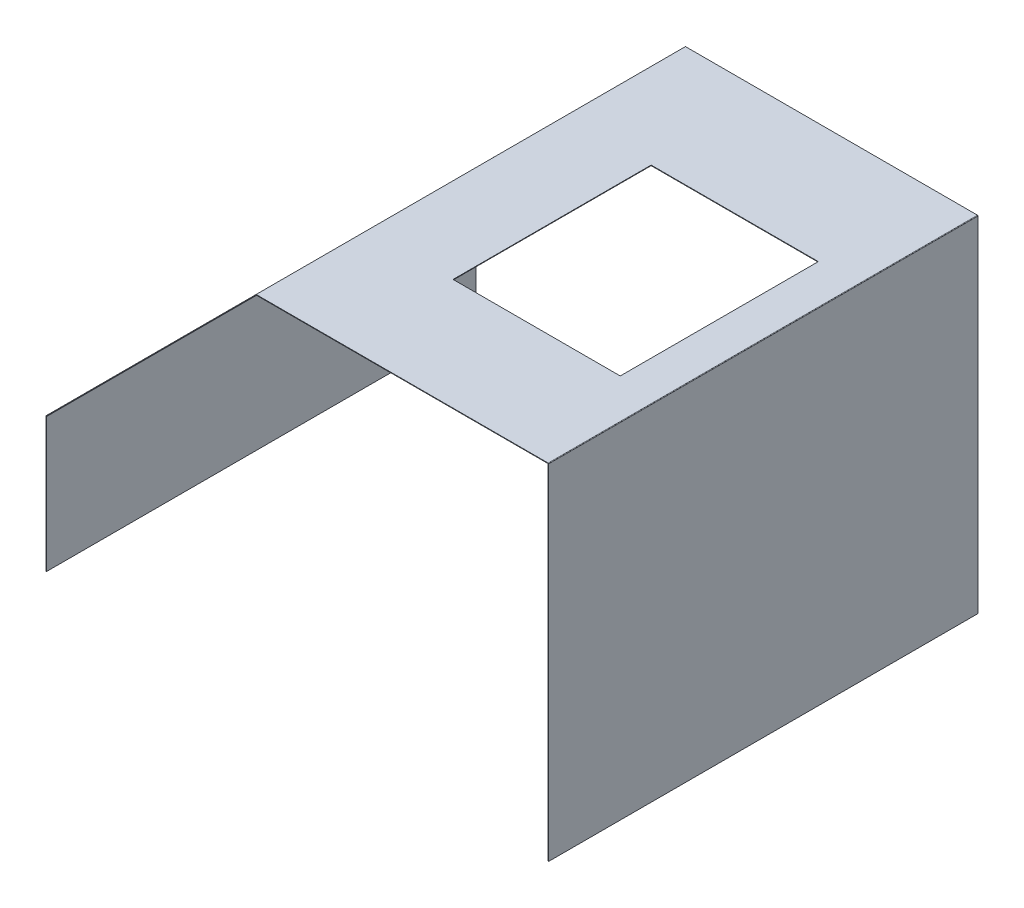
ISO-10303-21;
HEADER;
FILE_DESCRIPTION(('STEP AP214'),'2;1');
FILE_NAME('part.step','',(''),(''),'','','');
FILE_SCHEMA(('AUTOMOTIVE_DESIGN { 1 0 10303 214 1 1 1 1 }'));
ENDSEC;
DATA;
#1=APPLICATION_CONTEXT('core data for automotive mechanical design processes');
#2=APPLICATION_PROTOCOL_DEFINITION('international standard','automotive_design',2000,#1);
#3=PRODUCT_CONTEXT('',#1,'mechanical');
#4=PRODUCT('Part','Part','',(#3));
#5=PRODUCT_RELATED_PRODUCT_CATEGORY('part','',(#4));
#6=PRODUCT_DEFINITION_FORMATION('','',#4);
#7=PRODUCT_DEFINITION_CONTEXT('part definition',#1,'design');
#8=PRODUCT_DEFINITION('design','',#6,#7);
#9=PRODUCT_DEFINITION_SHAPE('','',#8);
#10=(LENGTH_UNIT() NAMED_UNIT(*) SI_UNIT(.MILLI.,.METRE.));
#11=(NAMED_UNIT(*) PLANE_ANGLE_UNIT() SI_UNIT($,.RADIAN.));
#12=(NAMED_UNIT(*) SI_UNIT($,.STERADIAN.) SOLID_ANGLE_UNIT());
#13=UNCERTAINTY_MEASURE_WITH_UNIT(LENGTH_MEASURE(1.E-05),#10,'distance_accuracy_value','');
#14=(GEOMETRIC_REPRESENTATION_CONTEXT(3) GLOBAL_UNCERTAINTY_ASSIGNED_CONTEXT((#13)) GLOBAL_UNIT_ASSIGNED_CONTEXT((#10,
#11,#12)) REPRESENTATION_CONTEXT('',''));
#15=CARTESIAN_POINT('',(0.,0.,0.));
#16=DIRECTION('',(0.,0.,1.));
#17=DIRECTION('',(1.,0.,0.));
#18=AXIS2_PLACEMENT_3D('',#15,#16,#17);
#19=CARTESIAN_POINT('',(705.,525.,655.66166));
#20=DIRECTION('',(1.,0.,0.));
#21=DIRECTION('',(0.,0.,-1.));
#22=AXIS2_PLACEMENT_3D('',#19,#20,#21);
#23=PLANE('',#22);
#24=DIRECTION('',(0.,1.,0.));
#25=VECTOR('',#24,1.);
#26=CARTESIAN_POINT('',(705.,525.,485.66166));
#27=LINE('',#26,#25);
#28=CARTESIAN_POINT('',(705.,525.,485.66166));
#29=VERTEX_POINT('',#28);
#30=CARTESIAN_POINT('',(705.,525.83566,485.66166));
#31=VERTEX_POINT('',#30);
#32=EDGE_CURVE('E474',#29,#31,#27,.T.);
#33=ORIENTED_EDGE('',*,*,#32,.T.);
#34=DIRECTION('',(0.,0.,-1.));
#35=VECTOR('',#34,1.);
#36=CARTESIAN_POINT('',(705.,525.83566,655.66166));
#37=LINE('',#36,#35);
#38=CARTESIAN_POINT('',(705.,525.83566,183.53566));
#39=VERTEX_POINT('',#38);
#40=EDGE_CURVE('E320',#31,#39,#37,.T.);
#41=ORIENTED_EDGE('',*,*,#40,.T.);
#42=DIRECTION('',(0.,1.,0.));
#43=VECTOR('',#42,1.);
#44=CARTESIAN_POINT('',(705.,525.,183.53566));
#45=LINE('',#44,#43);
#46=CARTESIAN_POINT('',(705.,525.,183.53566));
#47=VERTEX_POINT('',#46);
#48=EDGE_CURVE('E481',#47,#39,#45,.T.);
#49=ORIENTED_EDGE('',*,*,#48,.F.);
#50=DIRECTION('',(0.,0.,-1.));
#51=VECTOR('',#50,1.);
#52=CARTESIAN_POINT('',(705.,525.,655.66166));
#53=LINE('',#52,#51);
#54=EDGE_CURVE('E317',#29,#47,#53,.T.);
#55=ORIENTED_EDGE('',*,*,#54,.F.);
#56=EDGE_LOOP('',(#33,#41,#49,#55));
#57=FACE_BOUND('',#56,.T.);
#58=ADVANCED_FACE('F51',(#57),#23,.F.);
#59=CARTESIAN_POINT('',(450.,525.83566,655.66166));
#60=DIRECTION('',(-1.,0.,0.));
#61=DIRECTION('',(0.,0.,1.));
#62=AXIS2_PLACEMENT_3D('',#59,#60,#61);
#63=PLANE('',#62);
#64=DIRECTION('',(0.,-1.,0.));
#65=VECTOR('',#64,1.);
#66=CARTESIAN_POINT('',(450.,525.83566,485.66166));
#67=LINE('',#66,#65);
#68=CARTESIAN_POINT('',(450.,525.83566,485.66166));
#69=VERTEX_POINT('',#68);
#70=CARTESIAN_POINT('',(450.,525.,485.66166));
#71=VERTEX_POINT('',#70);
#72=EDGE_CURVE('E478',#69,#71,#67,.T.);
#73=ORIENTED_EDGE('',*,*,#72,.T.);
#74=DIRECTION('',(0.,0.,-1.));
#75=VECTOR('',#74,1.);
#76=CARTESIAN_POINT('',(450.,525.,655.66166));
#77=LINE('',#76,#75);
#78=CARTESIAN_POINT('',(450.,525.,183.53566));
#79=VERTEX_POINT('',#78);
#80=EDGE_CURVE('E369',#71,#79,#77,.T.);
#81=ORIENTED_EDGE('',*,*,#80,.T.);
#82=DIRECTION('',(0.,-1.,0.));
#83=VECTOR('',#82,1.);
#84=CARTESIAN_POINT('',(450.,525.83566,183.53566));
#85=LINE('',#84,#83);
#86=CARTESIAN_POINT('',(450.,525.83566,183.53566));
#87=VERTEX_POINT('',#86);
#88=EDGE_CURVE('E486',#87,#79,#85,.T.);
#89=ORIENTED_EDGE('',*,*,#88,.F.);
#90=DIRECTION('',(0.,0.,-1.));
#91=VECTOR('',#90,1.);
#92=CARTESIAN_POINT('',(450.,525.83566,655.66166));
#93=LINE('',#92,#91);
#94=EDGE_CURVE('E365',#69,#87,#93,.T.);
#95=ORIENTED_EDGE('',*,*,#94,.F.);
#96=EDGE_LOOP('',(#73,#81,#89,#95));
#97=FACE_BOUND('',#96,.T.);
#98=ADVANCED_FACE('F408',(#97),#63,.F.);
#99=CARTESIAN_POINT('',(320.,525.,13.53566));
#100=DIRECTION('',(-0.707106781186547,0.707106781186548,0.));
#101=DIRECTION('',(-0.707106781186548,-0.707106781186547,0.));
#102=AXIS2_PLACEMENT_3D('',#99,#100,#101);
#103=PLANE('',#102);
#104=DIRECTION('',(0.707106781186548,0.707106781186547,0.));
#105=VECTOR('',#104,1.);
#106=CARTESIAN_POINT('',(320.,525.,655.66166));
#107=LINE('',#106,#105);
#108=CARTESIAN_POINT('',(0.234314575050742,205.234314575051,655.66166));
#109=VERTEX_POINT('',#108);
#110=CARTESIAN_POINT('',(320.,525.,655.66166));
#111=VERTEX_POINT('',#110);
#112=EDGE_CURVE('E363',#109,#111,#107,.T.);
#113=ORIENTED_EDGE('',*,*,#112,.F.);
#114=DIRECTION('',(0.,0.,-1.));
#115=VECTOR('',#114,1.);
#116=CARTESIAN_POINT('',(0.234314575050769,205.234314575051,0.83566));
#117=LINE('',#116,#115);
#118=CARTESIAN_POINT('',(0.234314575050742,205.234314575051,0.83566));
#119=VERTEX_POINT('',#118);
#120=EDGE_CURVE('E264',#109,#119,#117,.T.);
#121=ORIENTED_EDGE('',*,*,#120,.T.);
#122=DIRECTION('',(0.707106781186548,0.707106781186547,0.));
#123=VECTOR('',#122,1.);
#124=CARTESIAN_POINT('',(320.,525.,0.83566));
#125=LINE('',#124,#123);
#126=CARTESIAN_POINT('',(320.,525.,0.83566));
#127=VERTEX_POINT('',#126);
#128=EDGE_CURVE('E308',#119,#127,#125,.T.);
#129=ORIENTED_EDGE('',*,*,#128,.T.);
#130=DIRECTION('',(0.,0.,-1.));
#131=VECTOR('',#130,1.);
#132=CARTESIAN_POINT('',(320.,525.,13.53566));
#133=LINE('',#132,#131);
#134=CARTESIAN_POINT('',(320.,525.,43.2486599999999));
#135=VERTEX_POINT('',#134);
#136=EDGE_CURVE('E260',#135,#127,#133,.T.);
#137=ORIENTED_EDGE('',*,*,#136,.F.);
#138=DIRECTION('',(-0.707106781186548,-0.707106781186547,0.));
#139=VECTOR('',#138,1.);
#140=CARTESIAN_POINT('',(320.,525.,43.2486599999999));
#141=LINE('',#140,#139);
#142=CARTESIAN_POINT('',(36.5247934744668,241.524793474467,43.24866));
#143=VERTEX_POINT('',#142);
#144=EDGE_CURVE('E463',#135,#143,#141,.T.);
#145=ORIENTED_EDGE('',*,*,#144,.T.);
#146=DIRECTION('',(0.,0.,1.));
#147=VECTOR('',#146,1.);
#148=CARTESIAN_POINT('',(36.5247934744667,241.524793474467,13.53566));
#149=LINE('',#148,#147);
#150=CARTESIAN_POINT('',(36.5247934744668,241.524793474467,613.24866));
#151=VERTEX_POINT('',#150);
#152=EDGE_CURVE('E452',#143,#151,#149,.T.);
#153=ORIENTED_EDGE('',*,*,#152,.T.);
#154=DIRECTION('',(0.707106781186548,0.707106781186547,0.));
#155=VECTOR('',#154,1.);
#156=CARTESIAN_POINT('',(320.,525.,613.24866));
#157=LINE('',#156,#155);
#158=CARTESIAN_POINT('',(320.,525.,613.24866));
#159=VERTEX_POINT('',#158);
#160=EDGE_CURVE('E469',#151,#159,#157,.T.);
#161=ORIENTED_EDGE('',*,*,#160,.T.);
#162=EDGE_CURVE('E261',#111,#159,#133,.T.);
#163=ORIENTED_EDGE('',*,*,#162,.F.);
#164=EDGE_LOOP('',(#113,#121,#129,#137,#145,#153,#161,#163));
#165=FACE_BOUND('',#164,.T.);
#166=ADVANCED_FACE('F361',(#165),#103,.F.);
#167=CARTESIAN_POINT('',(765.,525.,13.53566));
#168=DIRECTION('',(0.,1.,0.));
#169=DIRECTION('',(-1.,0.,0.));
#170=AXIS2_PLACEMENT_3D('',#167,#168,#169);
#171=PLANE('',#170);
#172=DIRECTION('',(1.,0.,0.));
#173=VECTOR('',#172,1.);
#174=CARTESIAN_POINT('',(765.,525.,0.83566));
#175=LINE('',#174,#173);
#176=CARTESIAN_POINT('',(764.2,525.,0.83566));
#177=VERTEX_POINT('',#176);
#178=EDGE_CURVE('E299',#127,#177,#175,.T.);
#179=ORIENTED_EDGE('',*,*,#178,.T.);
#180=DIRECTION('',(0.,0.,-1.));
#181=VECTOR('',#180,1.);
#182=CARTESIAN_POINT('',(764.2,525.,655.66166));
#183=LINE('',#182,#181);
#184=CARTESIAN_POINT('',(764.2,525.,655.66166));
#185=VERTEX_POINT('',#184);
#186=EDGE_CURVE('E72',#177,#185,#183,.F.);
#187=ORIENTED_EDGE('',*,*,#186,.T.);
#188=DIRECTION('',(1.,0.,0.));
#189=VECTOR('',#188,1.);
#190=CARTESIAN_POINT('',(765.,525.,655.66166));
#191=LINE('',#190,#189);
#192=EDGE_CURVE('E318',#111,#185,#191,.T.);
#193=ORIENTED_EDGE('',*,*,#192,.F.);
#194=ORIENTED_EDGE('',*,*,#162,.T.);
#195=DIRECTION('',(1.,0.,0.));
#196=VECTOR('',#195,1.);
#197=CARTESIAN_POINT('',(765.,525.,613.24866));
#198=LINE('',#197,#196);
#199=CARTESIAN_POINT('',(320.489518294468,525.,613.24866));
#200=VERTEX_POINT('',#199);
#201=EDGE_CURVE('E466',#159,#200,#198,.T.);
#202=ORIENTED_EDGE('',*,*,#201,.T.);
#203=DIRECTION('',(0.,0.,-1.));
#204=VECTOR('',#203,1.);
#205=CARTESIAN_POINT('',(320.489518294468,525.,13.53566));
#206=LINE('',#205,#204);
#207=CARTESIAN_POINT('',(320.489518294468,525.,43.2486599999999));
#208=VERTEX_POINT('',#207);
#209=EDGE_CURVE('E456',#200,#208,#206,.T.);
#210=ORIENTED_EDGE('',*,*,#209,.T.);
#211=DIRECTION('',(-1.,0.,0.));
#212=VECTOR('',#211,1.);
#213=CARTESIAN_POINT('',(765.,525.,43.2486599999998));
#214=LINE('',#213,#212);
#215=EDGE_CURVE('E214',#208,#135,#214,.T.);
#216=ORIENTED_EDGE('',*,*,#215,.T.);
#217=ORIENTED_EDGE('',*,*,#136,.T.);
#218=EDGE_LOOP('',(#179,#187,#193,#194,#202,#210,#216,#217));
#219=FACE_BOUND('',#218,.T.);
#220=DIRECTION('',(1.,0.,0.));
#221=VECTOR('',#220,1.);
#222=CARTESIAN_POINT('',(450.,525.,485.66166));
#223=LINE('',#222,#221);
#224=EDGE_CURVE('E471',#71,#29,#223,.T.);
#225=ORIENTED_EDGE('',*,*,#224,.T.);
#226=ORIENTED_EDGE('',*,*,#54,.T.);
#227=DIRECTION('',(1.,0.,0.));
#228=VECTOR('',#227,1.);
#229=CARTESIAN_POINT('',(450.,525.,183.53566));
#230=LINE('',#229,#228);
#231=EDGE_CURVE('E489',#79,#47,#230,.T.);
#232=ORIENTED_EDGE('',*,*,#231,.F.);
#233=ORIENTED_EDGE('',*,*,#80,.F.);
#234=EDGE_LOOP('',(#225,#226,#232,#233));
#235=FACE_BOUND('',#234,.T.);
#236=ADVANCED_FACE('F305',(#219,#235),#171,.F.);
#237=CARTESIAN_POINT('',(765.,0.,13.53566));
#238=DIRECTION('',(1.,0.,0.));
#239=DIRECTION('',(0.,0.,-1.));
#240=AXIS2_PLACEMENT_3D('',#237,#238,#239);
#241=PLANE('',#240);
#242=DIRECTION('',(0.,-1.,0.));
#243=VECTOR('',#242,1.);
#244=CARTESIAN_POINT('',(765.,525.,655.66166));
#245=LINE('',#244,#243);
#246=CARTESIAN_POINT('',(765.,524.2,655.66166));
#247=VERTEX_POINT('',#246);
#248=CARTESIAN_POINT('',(765.,0.,655.66166));
#249=VERTEX_POINT('',#248);
#250=EDGE_CURVE('E314',#247,#249,#245,.T.);
#251=ORIENTED_EDGE('',*,*,#250,.F.);
#252=DIRECTION('',(0.,0.,-1.));
#253=VECTOR('',#252,1.);
#254=CARTESIAN_POINT('',(765.,524.2,0.83566));
#255=LINE('',#254,#253);
#256=CARTESIAN_POINT('',(765.,524.2,0.83566));
#257=VERTEX_POINT('',#256);
#258=EDGE_CURVE('E282',#247,#257,#255,.T.);
#259=ORIENTED_EDGE('',*,*,#258,.T.);
#260=DIRECTION('',(0.,-1.,0.));
#261=VECTOR('',#260,1.);
#262=CARTESIAN_POINT('',(765.,0.,0.83566));
#263=LINE('',#262,#261);
#264=CARTESIAN_POINT('',(765.,0.,0.83566));
#265=VERTEX_POINT('',#264);
#266=EDGE_CURVE('E301',#257,#265,#263,.T.);
#267=ORIENTED_EDGE('',*,*,#266,.T.);
#268=DIRECTION('',(0.,0.,-1.));
#269=VECTOR('',#268,1.);
#270=CARTESIAN_POINT('',(765.,0.,13.53566));
#271=LINE('',#270,#269);
#272=EDGE_CURVE('E257',#249,#265,#271,.T.);
#273=ORIENTED_EDGE('',*,*,#272,.F.);
#274=EDGE_LOOP('',(#251,#259,#267,#273));
#275=FACE_BOUND('',#274,.T.);
#276=ADVANCED_FACE('F312',(#275),#241,.F.);
#277=CARTESIAN_POINT('',(765.,0.,13.53566));
#278=DIRECTION('',(0.,1.,0.));
#279=DIRECTION('',(0.,0.,1.));
#280=AXIS2_PLACEMENT_3D('',#277,#278,#279);
#281=PLANE('',#280);
#282=DIRECTION('',(1.,0.,0.));
#283=VECTOR('',#282,1.);
#284=CARTESIAN_POINT('',(765.,0.,0.83566));
#285=LINE('',#284,#283);
#286=CARTESIAN_POINT('',(765.83566,0.,0.83566));
#287=VERTEX_POINT('',#286);
#288=EDGE_CURVE('E329',#265,#287,#285,.T.);
#289=ORIENTED_EDGE('',*,*,#288,.T.);
#290=DIRECTION('',(0.,0.,-1.));
#291=VECTOR('',#290,1.);
#292=CARTESIAN_POINT('',(765.83566,0.,13.53566));
#293=LINE('',#292,#291);
#294=CARTESIAN_POINT('',(765.83566,0.,655.66166));
#295=VERTEX_POINT('',#294);
#296=EDGE_CURVE('E249',#295,#287,#293,.T.);
#297=ORIENTED_EDGE('',*,*,#296,.F.);
#298=DIRECTION('',(1.,0.,0.));
#299=VECTOR('',#298,1.);
#300=CARTESIAN_POINT('',(765.,0.,655.66166));
#301=LINE('',#300,#299);
#302=EDGE_CURVE('E379',#249,#295,#301,.T.);
#303=ORIENTED_EDGE('',*,*,#302,.F.);
#304=ORIENTED_EDGE('',*,*,#272,.T.);
#305=EDGE_LOOP('',(#289,#297,#303,#304));
#306=FACE_BOUND('',#305,.T.);
#307=ADVANCED_FACE('F509',(#306),#281,.F.);
#308=CARTESIAN_POINT('',(765.83566,0.,13.53566));
#309=DIRECTION('',(-1.,0.,0.));
#310=DIRECTION('',(0.,0.,1.));
#311=AXIS2_PLACEMENT_3D('',#308,#309,#310);
#312=PLANE('',#311);
#313=DIRECTION('',(0.,1.,0.));
#314=VECTOR('',#313,1.);
#315=CARTESIAN_POINT('',(765.83566,0.,0.83566));
#316=LINE('',#315,#314);
#317=CARTESIAN_POINT('',(765.83566,525.03566,0.83566));
#318=VERTEX_POINT('',#317);
#319=EDGE_CURVE('E331',#287,#318,#316,.T.);
#320=ORIENTED_EDGE('',*,*,#319,.T.);
#321=DIRECTION('',(0.,0.,-1.));
#322=VECTOR('',#321,1.);
#323=CARTESIAN_POINT('',(765.83566,525.03566,13.53566));
#324=LINE('',#323,#322);
#325=CARTESIAN_POINT('',(765.83566,525.03566,655.66166));
#326=VERTEX_POINT('',#325);
#327=EDGE_CURVE('E288',#318,#326,#324,.F.);
#328=ORIENTED_EDGE('',*,*,#327,.T.);
#329=DIRECTION('',(0.,1.,0.));
#330=VECTOR('',#329,1.);
#331=CARTESIAN_POINT('',(765.83566,0.,655.66166));
#332=LINE('',#331,#330);
#333=EDGE_CURVE('E381',#295,#326,#332,.T.);
#334=ORIENTED_EDGE('',*,*,#333,.F.);
#335=ORIENTED_EDGE('',*,*,#296,.T.);
#336=EDGE_LOOP('',(#320,#328,#334,#335));
#337=FACE_BOUND('',#336,.T.);
#338=ADVANCED_FACE('F502',(#337),#312,.F.);
#339=CARTESIAN_POINT('',(765.83566,525.83566,13.53566));
#340=DIRECTION('',(0.,-1.,0.));
#341=DIRECTION('',(0.,0.,-1.));
#342=AXIS2_PLACEMENT_3D('',#339,#340,#341);
#343=PLANE('',#342);
#344=ORIENTED_EDGE('',*,*,#40,.F.);
#345=DIRECTION('',(-1.,0.,0.));
#346=VECTOR('',#345,1.);
#347=CARTESIAN_POINT('',(705.,525.83566,485.66166));
#348=LINE('',#347,#346);
#349=EDGE_CURVE('E476',#31,#69,#348,.T.);
#350=ORIENTED_EDGE('',*,*,#349,.T.);
#351=ORIENTED_EDGE('',*,*,#94,.T.);
#352=DIRECTION('',(-1.,0.,0.));
#353=VECTOR('',#352,1.);
#354=CARTESIAN_POINT('',(705.,525.83566,183.53566));
#355=LINE('',#354,#353);
#356=EDGE_CURVE('E483',#39,#87,#355,.T.);
#357=ORIENTED_EDGE('',*,*,#356,.F.);
#358=EDGE_LOOP('',(#344,#350,#351,#357));
#359=FACE_BOUND('',#358,.T.);
#360=DIRECTION('',(-1.,0.,0.));
#361=VECTOR('',#360,1.);
#362=CARTESIAN_POINT('',(705.,525.83566,655.66166));
#363=LINE('',#362,#361);
#364=CARTESIAN_POINT('',(765.03566,525.83566,655.66166));
#365=VERTEX_POINT('',#364);
#366=CARTESIAN_POINT('',(319.653858294467,525.83566,655.66166));
#367=VERTEX_POINT('',#366);
#368=EDGE_CURVE('E322',#365,#367,#363,.T.);
#369=ORIENTED_EDGE('',*,*,#368,.F.);
#370=DIRECTION('',(0.,0.,-1.));
#371=VECTOR('',#370,1.);
#372=CARTESIAN_POINT('',(765.03566,525.83566,13.53566));
#373=LINE('',#372,#371);
#374=CARTESIAN_POINT('',(765.03566,525.83566,0.83566));
#375=VERTEX_POINT('',#374);
#376=EDGE_CURVE('E286',#365,#375,#373,.T.);
#377=ORIENTED_EDGE('',*,*,#376,.T.);
#378=DIRECTION('',(-1.,0.,0.));
#379=VECTOR('',#378,1.);
#380=CARTESIAN_POINT('',(765.83566,525.83566,0.83566));
#381=LINE('',#380,#379);
#382=CARTESIAN_POINT('',(319.653858294467,525.83566,0.83566));
#383=VERTEX_POINT('',#382);
#384=EDGE_CURVE('E245',#375,#383,#381,.T.);
#385=ORIENTED_EDGE('',*,*,#384,.T.);
#386=DIRECTION('',(0.,0.,-1.));
#387=VECTOR('',#386,1.);
#388=CARTESIAN_POINT('',(319.653858294467,525.83566,13.53566));
#389=LINE('',#388,#387);
#390=CARTESIAN_POINT('',(319.653858294467,525.83566,43.2486599999999));
#391=VERTEX_POINT('',#390);
#392=EDGE_CURVE('E235',#391,#383,#389,.T.);
#393=ORIENTED_EDGE('',*,*,#392,.F.);
#394=DIRECTION('',(0.,0.,-1.));
#395=VECTOR('',#394,1.);
#396=CARTESIAN_POINT('',(319.653858294467,525.83566,43.2486599999999));
#397=LINE('',#396,#395);
#398=CARTESIAN_POINT('',(319.653858294467,525.83566,613.24866));
#399=VERTEX_POINT('',#398);
#400=EDGE_CURVE('E222',#399,#391,#397,.T.);
#401=ORIENTED_EDGE('',*,*,#400,.F.);
#402=EDGE_CURVE('E246',#367,#399,#389,.T.);
#403=ORIENTED_EDGE('',*,*,#402,.F.);
#404=EDGE_LOOP('',(#369,#377,#385,#393,#401,#403));
#405=FACE_BOUND('',#404,.T.);
#406=ADVANCED_FACE('F242',(#359,#405),#343,.F.);
#407=CARTESIAN_POINT('',(319.653858294467,525.83566,13.53566));
#408=DIRECTION('',(0.707106781186548,-0.707106781186548,0.));
#409=DIRECTION('',(0.707106781186548,0.707106781186548,0.));
#410=AXIS2_PLACEMENT_3D('',#407,#408,#409);
#411=PLANE('',#410);
#412=DIRECTION('',(-0.707106781186547,-0.707106781186547,0.));
#413=VECTOR('',#412,1.);
#414=CARTESIAN_POINT('',(319.653858294467,525.83566,0.83566));
#415=LINE('',#414,#413);
#416=CARTESIAN_POINT('',(-0.601345424949162,205.580456280583,0.83566));
#417=VERTEX_POINT('',#416);
#418=EDGE_CURVE('E335',#383,#417,#415,.T.);
#419=ORIENTED_EDGE('',*,*,#418,.T.);
#420=DIRECTION('',(0.,0.,-1.));
#421=VECTOR('',#420,1.);
#422=CARTESIAN_POINT('',(-0.601345424949218,205.580456280583,13.53566));
#423=LINE('',#422,#421);
#424=CARTESIAN_POINT('',(-0.601345424949229,205.580456280583,655.66166));
#425=VERTEX_POINT('',#424);
#426=EDGE_CURVE('E276',#417,#425,#423,.F.);
#427=ORIENTED_EDGE('',*,*,#426,.T.);
#428=DIRECTION('',(-0.707106781186547,-0.707106781186547,0.));
#429=VECTOR('',#428,1.);
#430=CARTESIAN_POINT('',(-0.83566,205.346141705533,655.66166));
#431=LINE('',#430,#429);
#432=EDGE_CURVE('E376',#367,#425,#431,.T.);
#433=ORIENTED_EDGE('',*,*,#432,.F.);
#434=ORIENTED_EDGE('',*,*,#402,.T.);
#435=DIRECTION('',(0.707106781186547,0.707106781186548,0.));
#436=VECTOR('',#435,1.);
#437=CARTESIAN_POINT('',(35.9338926217004,242.115694327233,613.24866));
#438=LINE('',#437,#436);
#439=CARTESIAN_POINT('',(35.9338926217004,242.115694327233,613.24866));
#440=VERTEX_POINT('',#439);
#441=EDGE_CURVE('E229',#440,#399,#438,.T.);
#442=ORIENTED_EDGE('',*,*,#441,.F.);
#443=DIRECTION('',(0.,0.,1.));
#444=VECTOR('',#443,1.);
#445=CARTESIAN_POINT('',(35.9338926217004,242.115694327233,43.24866));
#446=LINE('',#445,#444);
#447=CARTESIAN_POINT('',(35.9338926217004,242.115694327233,43.24866));
#448=VERTEX_POINT('',#447);
#449=EDGE_CURVE('E239',#448,#440,#446,.T.);
#450=ORIENTED_EDGE('',*,*,#449,.F.);
#451=DIRECTION('',(-0.707106781186547,-0.707106781186548,0.));
#452=VECTOR('',#451,1.);
#453=CARTESIAN_POINT('',(35.9338926217004,242.115694327233,43.24866));
#454=LINE('',#453,#452);
#455=EDGE_CURVE('E211',#391,#448,#454,.T.);
#456=ORIENTED_EDGE('',*,*,#455,.F.);
#457=ORIENTED_EDGE('',*,*,#392,.T.);
#458=EDGE_LOOP('',(#419,#427,#433,#434,#442,#450,#456,#457));
#459=FACE_BOUND('',#458,.T.);
#460=ADVANCED_FACE('F234',(#459),#411,.F.);
#461=CARTESIAN_POINT('',(-0.83566,205.346141705533,13.53566));
#462=DIRECTION('',(1.,0.,0.));
#463=DIRECTION('',(0.,0.,-1.));
#464=AXIS2_PLACEMENT_3D('',#461,#462,#463);
#465=PLANE('',#464);
#466=DIRECTION('',(0.,-1.,0.));
#467=VECTOR('',#466,1.);
#468=CARTESIAN_POINT('',(-0.83566,0.,655.66166));
#469=LINE('',#468,#467);
#470=CARTESIAN_POINT('',(-0.83566,205.014770855634,655.66166));
#471=VERTEX_POINT('',#470);
#472=CARTESIAN_POINT('',(-0.83566,0.,655.66166));
#473=VERTEX_POINT('',#472);
#474=EDGE_CURVE('E374',#471,#473,#469,.T.);
#475=ORIENTED_EDGE('',*,*,#474,.F.);
#476=DIRECTION('',(0.,0.,-1.));
#477=VECTOR('',#476,1.);
#478=CARTESIAN_POINT('',(-0.83566,205.014770855634,13.53566));
#479=LINE('',#478,#477);
#480=CARTESIAN_POINT('',(-0.83566,205.014770855634,0.83566));
#481=VERTEX_POINT('',#480);
#482=EDGE_CURVE('E269',#471,#481,#479,.T.);
#483=ORIENTED_EDGE('',*,*,#482,.T.);
#484=DIRECTION('',(0.,-1.,0.));
#485=VECTOR('',#484,1.);
#486=CARTESIAN_POINT('',(-0.83566,205.346141705533,0.83566));
#487=LINE('',#486,#485);
#488=CARTESIAN_POINT('',(-0.83566,0.,0.83566));
#489=VERTEX_POINT('',#488);
#490=EDGE_CURVE('E337',#481,#489,#487,.T.);
#491=ORIENTED_EDGE('',*,*,#490,.T.);
#492=DIRECTION('',(0.,0.,-1.));
#493=VECTOR('',#492,1.);
#494=CARTESIAN_POINT('',(-0.83566,0.,13.53566));
#495=LINE('',#494,#493);
#496=EDGE_CURVE('E247',#473,#489,#495,.T.);
#497=ORIENTED_EDGE('',*,*,#496,.F.);
#498=EDGE_LOOP('',(#475,#483,#491,#497));
#499=FACE_BOUND('',#498,.T.);
#500=ADVANCED_FACE('F395',(#499),#465,.F.);
#501=CARTESIAN_POINT('',(0.,0.,13.53566));
#502=DIRECTION('',(0.,1.,0.));
#503=DIRECTION('',(0.,0.,1.));
#504=AXIS2_PLACEMENT_3D('',#501,#502,#503);
#505=PLANE('',#504);
#506=DIRECTION('',(1.,0.,0.));
#507=VECTOR('',#506,1.);
#508=CARTESIAN_POINT('',(0.,0.,0.83566));
#509=LINE('',#508,#507);
#510=CARTESIAN_POINT('',(0.,0.,0.83566));
#511=VERTEX_POINT('',#510);
#512=EDGE_CURVE('E339',#489,#511,#509,.T.);
#513=ORIENTED_EDGE('',*,*,#512,.T.);
#514=DIRECTION('',(0.,0.,-1.));
#515=VECTOR('',#514,1.);
#516=CARTESIAN_POINT('',(0.,0.,13.53566));
#517=LINE('',#516,#515);
#518=CARTESIAN_POINT('',(0.,0.,655.66166));
#519=VERTEX_POINT('',#518);
#520=EDGE_CURVE('E251',#519,#511,#517,.T.);
#521=ORIENTED_EDGE('',*,*,#520,.F.);
#522=DIRECTION('',(1.,0.,0.));
#523=VECTOR('',#522,1.);
#524=CARTESIAN_POINT('',(0.,0.,655.66166));
#525=LINE('',#524,#523);
#526=EDGE_CURVE('E367',#473,#519,#525,.T.);
#527=ORIENTED_EDGE('',*,*,#526,.F.);
#528=ORIENTED_EDGE('',*,*,#496,.T.);
#529=EDGE_LOOP('',(#513,#521,#527,#528));
#530=FACE_BOUND('',#529,.T.);
#531=ADVANCED_FACE('F396',(#530),#505,.F.);
#532=CARTESIAN_POINT('',(0.,205.,13.53566));
#533=DIRECTION('',(-1.,0.,0.));
#534=DIRECTION('',(0.,-1.,0.));
#535=AXIS2_PLACEMENT_3D('',#532,#533,#534);
#536=PLANE('',#535);
#537=DIRECTION('',(0.,1.,0.));
#538=VECTOR('',#537,1.);
#539=CARTESIAN_POINT('',(0.,205.,0.83566));
#540=LINE('',#539,#538);
#541=CARTESIAN_POINT('',(0.,204.668629150101,0.83566));
#542=VERTEX_POINT('',#541);
#543=EDGE_CURVE('E341',#511,#542,#540,.T.);
#544=ORIENTED_EDGE('',*,*,#543,.T.);
#545=DIRECTION('',(0.,0.,-1.));
#546=VECTOR('',#545,1.);
#547=CARTESIAN_POINT('',(0.,204.668629150101,655.66166));
#548=LINE('',#547,#546);
#549=CARTESIAN_POINT('',(0.,204.668629150101,655.66166));
#550=VERTEX_POINT('',#549);
#551=EDGE_CURVE('E267',#542,#550,#548,.F.);
#552=ORIENTED_EDGE('',*,*,#551,.T.);
#553=DIRECTION('',(0.,1.,0.));
#554=VECTOR('',#553,1.);
#555=CARTESIAN_POINT('',(0.,205.,655.66166));
#556=LINE('',#555,#554);
#557=EDGE_CURVE('E350',#519,#550,#556,.T.);
#558=ORIENTED_EDGE('',*,*,#557,.F.);
#559=ORIENTED_EDGE('',*,*,#520,.T.);
#560=EDGE_LOOP('',(#544,#552,#558,#559));
#561=FACE_BOUND('',#560,.T.);
#562=ADVANCED_FACE('F347',(#561),#536,.F.);
#563=CARTESIAN_POINT('',(0.,0.,0.83566));
#564=DIRECTION('',(0.,0.,1.));
#565=DIRECTION('',(1.,0.,0.));
#566=AXIS2_PLACEMENT_3D('',#563,#564,#565);
#567=PLANE('',#566);
#568=ORIENTED_EDGE('',*,*,#490,.F.);
#569=CARTESIAN_POINT('',(-0.0356600000000001,205.014770855634,0.83566));
#570=DIRECTION('',(0.,0.,1.));
#571=DIRECTION('',(1.,0.,0.));
#572=AXIS2_PLACEMENT_3D('',#569,#570,#571);
#573=CIRCLE('',#572,0.8);
#574=EDGE_CURVE('E274',#481,#417,#573,.F.);
#575=ORIENTED_EDGE('',*,*,#574,.T.);
#576=ORIENTED_EDGE('',*,*,#418,.F.);
#577=ORIENTED_EDGE('',*,*,#384,.F.);
#578=CARTESIAN_POINT('',(765.03566,525.03566,0.83566));
#579=DIRECTION('',(0.,0.,1.));
#580=DIRECTION('',(1.,0.,0.));
#581=AXIS2_PLACEMENT_3D('',#578,#579,#580);
#582=CIRCLE('',#581,0.8);
#583=EDGE_CURVE('E272',#375,#318,#582,.F.);
#584=ORIENTED_EDGE('',*,*,#583,.T.);
#585=ORIENTED_EDGE('',*,*,#319,.F.);
#586=ORIENTED_EDGE('',*,*,#288,.F.);
#587=ORIENTED_EDGE('',*,*,#266,.F.);
#588=CARTESIAN_POINT('',(764.2,524.2,0.83566));
#589=DIRECTION('',(0.,0.,1.));
#590=DIRECTION('',(1.,0.,0.));
#591=AXIS2_PLACEMENT_3D('',#588,#589,#590);
#592=CIRCLE('',#591,0.8);
#593=EDGE_CURVE('E59',#257,#177,#592,.T.);
#594=ORIENTED_EDGE('',*,*,#593,.T.);
#595=ORIENTED_EDGE('',*,*,#178,.F.);
#596=ORIENTED_EDGE('',*,*,#128,.F.);
#597=CARTESIAN_POINT('',(0.800000000000023,204.668629150101,0.83566));
#598=DIRECTION('',(0.,0.,1.));
#599=DIRECTION('',(1.,0.,0.));
#600=AXIS2_PLACEMENT_3D('',#597,#598,#599);
#601=CIRCLE('',#600,0.8);
#602=EDGE_CURVE('E290',#119,#542,#601,.T.);
#603=ORIENTED_EDGE('',*,*,#602,.T.);
#604=ORIENTED_EDGE('',*,*,#543,.F.);
#605=ORIENTED_EDGE('',*,*,#512,.F.);
#606=EDGE_LOOP('',(#568,#575,#576,#577,#584,#585,#586,#587,#594,#595,#596,#603,#604,#605));
#607=FACE_BOUND('',#606,.T.);
#608=ADVANCED_FACE('F297',(#607),#567,.F.);
#609=CARTESIAN_POINT('',(0.,0.,655.66166));
#610=DIRECTION('',(0.,0.,1.));
#611=DIRECTION('',(1.,0.,0.));
#612=AXIS2_PLACEMENT_3D('',#609,#610,#611);
#613=PLANE('',#612);
#614=ORIENTED_EDGE('',*,*,#432,.T.);
#615=CARTESIAN_POINT('',(-0.0356600000000001,205.014770855634,655.66166));
#616=DIRECTION('',(0.,0.,1.));
#617=DIRECTION('',(1.,0.,0.));
#618=AXIS2_PLACEMENT_3D('',#615,#616,#617);
#619=CIRCLE('',#618,0.8);
#620=EDGE_CURVE('E280',#425,#471,#619,.T.);
#621=ORIENTED_EDGE('',*,*,#620,.T.);
#622=ORIENTED_EDGE('',*,*,#474,.T.);
#623=ORIENTED_EDGE('',*,*,#526,.T.);
#624=ORIENTED_EDGE('',*,*,#557,.T.);
#625=CARTESIAN_POINT('',(0.800000000000023,204.668629150101,655.66166));
#626=DIRECTION('',(0.,0.,1.));
#627=DIRECTION('',(1.,0.,0.));
#628=AXIS2_PLACEMENT_3D('',#625,#626,#627);
#629=CIRCLE('',#628,0.8);
#630=EDGE_CURVE('E292',#550,#109,#629,.F.);
#631=ORIENTED_EDGE('',*,*,#630,.T.);
#632=ORIENTED_EDGE('',*,*,#112,.T.);
#633=ORIENTED_EDGE('',*,*,#192,.T.);
#634=CARTESIAN_POINT('',(764.2,524.2,655.66166));
#635=DIRECTION('',(0.,0.,1.));
#636=DIRECTION('',(1.,0.,0.));
#637=AXIS2_PLACEMENT_3D('',#634,#635,#636);
#638=CIRCLE('',#637,0.8);
#639=EDGE_CURVE('E11',#185,#247,#638,.F.);
#640=ORIENTED_EDGE('',*,*,#639,.T.);
#641=ORIENTED_EDGE('',*,*,#250,.T.);
#642=ORIENTED_EDGE('',*,*,#302,.T.);
#643=ORIENTED_EDGE('',*,*,#333,.T.);
#644=CARTESIAN_POINT('',(765.03566,525.03566,655.66166));
#645=DIRECTION('',(0.,0.,1.));
#646=DIRECTION('',(1.,0.,0.));
#647=AXIS2_PLACEMENT_3D('',#644,#645,#646);
#648=CIRCLE('',#647,0.8);
#649=EDGE_CURVE('E278',#326,#365,#648,.T.);
#650=ORIENTED_EDGE('',*,*,#649,.T.);
#651=ORIENTED_EDGE('',*,*,#368,.T.);
#652=EDGE_LOOP('',(#614,#621,#622,#623,#624,#631,#632,#633,#640,#641,#642,#643,#650,#651));
#653=FACE_BOUND('',#652,.T.);
#654=ADVANCED_FACE('F383',(#653),#613,.T.);
#655=CARTESIAN_POINT('',(0.,0.,183.53566));
#656=DIRECTION('',(0.,0.,1.));
#657=DIRECTION('',(1.,0.,0.));
#658=AXIS2_PLACEMENT_3D('',#655,#656,#657);
#659=PLANE('',#658);
#660=ORIENTED_EDGE('',*,*,#48,.T.);
#661=ORIENTED_EDGE('',*,*,#356,.T.);
#662=ORIENTED_EDGE('',*,*,#88,.T.);
#663=ORIENTED_EDGE('',*,*,#231,.T.);
#664=EDGE_LOOP('',(#660,#661,#662,#663));
#665=FACE_BOUND('',#664,.T.);
#666=ADVANCED_FACE('F423',(#665),#659,.T.);
#667=CARTESIAN_POINT('',(0.,0.,485.66166));
#668=DIRECTION('',(0.,0.,1.));
#669=DIRECTION('',(1.,0.,0.));
#670=AXIS2_PLACEMENT_3D('',#667,#668,#669);
#671=PLANE('',#670);
#672=ORIENTED_EDGE('',*,*,#224,.F.);
#673=ORIENTED_EDGE('',*,*,#72,.F.);
#674=ORIENTED_EDGE('',*,*,#349,.F.);
#675=ORIENTED_EDGE('',*,*,#32,.F.);
#676=EDGE_LOOP('',(#672,#673,#674,#675));
#677=FACE_BOUND('',#676,.T.);
#678=ADVANCED_FACE('F427',(#677),#671,.F.);
#679=CARTESIAN_POINT('',(170.284181047144,107.765405901789,613.24866));
#680=DIRECTION('',(0.,0.,1.));
#681=DIRECTION('',(0.,-1.,0.));
#682=AXIS2_PLACEMENT_3D('',#679,#680,#681);
#683=PLANE('',#682);
#684=DIRECTION('',(-0.707106781186548,0.707106781186547,0.));
#685=VECTOR('',#684,1.);
#686=CARTESIAN_POINT('',(170.284181047144,107.765405901789,613.24866));
#687=LINE('',#686,#685);
#688=EDGE_CURVE('E454',#151,#440,#687,.T.);
#689=ORIENTED_EDGE('',*,*,#688,.T.);
#690=ORIENTED_EDGE('',*,*,#441,.T.);
#691=DIRECTION('',(-0.707106781186548,0.707106781186547,0.));
#692=VECTOR('',#691,1.);
#693=CARTESIAN_POINT('',(454.004146719911,391.485371574556,613.24866));
#694=LINE('',#693,#692);
#695=EDGE_CURVE('E218',#200,#399,#694,.T.);
#696=ORIENTED_EDGE('',*,*,#695,.F.);
#697=ORIENTED_EDGE('',*,*,#201,.F.);
#698=ORIENTED_EDGE('',*,*,#160,.F.);
#699=EDGE_LOOP('',(#689,#690,#696,#697,#698));
#700=FACE_BOUND('',#699,.T.);
#701=ADVANCED_FACE('F433',(#700),#683,.F.);
#702=CARTESIAN_POINT('',(170.284181047144,107.765405901789,43.24866));
#703=DIRECTION('',(-0.707106781186547,-0.707106781186548,0.));
#704=DIRECTION('',(0.707106781186548,-0.707106781186547,0.));
#705=AXIS2_PLACEMENT_3D('',#702,#703,#704);
#706=PLANE('',#705);
#707=DIRECTION('',(-0.707106781186548,0.707106781186547,0.));
#708=VECTOR('',#707,1.);
#709=CARTESIAN_POINT('',(170.284181047144,107.765405901789,43.24866));
#710=LINE('',#709,#708);
#711=EDGE_CURVE('E217',#143,#448,#710,.T.);
#712=ORIENTED_EDGE('',*,*,#711,.T.);
#713=ORIENTED_EDGE('',*,*,#449,.T.);
#714=ORIENTED_EDGE('',*,*,#688,.F.);
#715=ORIENTED_EDGE('',*,*,#152,.F.);
#716=EDGE_LOOP('',(#712,#713,#714,#715));
#717=FACE_BOUND('',#716,.T.);
#718=ADVANCED_FACE('F440',(#717),#706,.F.);
#719=CARTESIAN_POINT('',(170.284181047144,107.765405901789,43.24866));
#720=DIRECTION('',(0.,0.,-1.));
#721=DIRECTION('',(0.,1.,0.));
#722=AXIS2_PLACEMENT_3D('',#719,#720,#721);
#723=PLANE('',#722);
#724=ORIENTED_EDGE('',*,*,#215,.F.);
#725=DIRECTION('',(-0.707106781186548,0.707106781186547,0.));
#726=VECTOR('',#725,1.);
#727=CARTESIAN_POINT('',(454.004146719911,391.485371574556,43.2486599999999));
#728=LINE('',#727,#726);
#729=EDGE_CURVE('E206',#208,#391,#728,.T.);
#730=ORIENTED_EDGE('',*,*,#729,.T.);
#731=ORIENTED_EDGE('',*,*,#455,.T.);
#732=ORIENTED_EDGE('',*,*,#711,.F.);
#733=ORIENTED_EDGE('',*,*,#144,.F.);
#734=EDGE_LOOP('',(#724,#730,#731,#732,#733));
#735=FACE_BOUND('',#734,.T.);
#736=ADVANCED_FACE('F208',(#735),#723,.F.);
#737=CARTESIAN_POINT('',(454.004146719911,391.485371574556,43.2486599999999));
#738=DIRECTION('',(0.707106781186547,0.707106781186548,0.));
#739=DIRECTION('',(-0.707106781186548,0.707106781186547,0.));
#740=AXIS2_PLACEMENT_3D('',#737,#738,#739);
#741=PLANE('',#740);
#742=ORIENTED_EDGE('',*,*,#695,.T.);
#743=ORIENTED_EDGE('',*,*,#400,.T.);
#744=ORIENTED_EDGE('',*,*,#729,.F.);
#745=ORIENTED_EDGE('',*,*,#209,.F.);
#746=EDGE_LOOP('',(#742,#743,#744,#745));
#747=FACE_BOUND('',#746,.T.);
#748=ADVANCED_FACE('F223',(#747),#741,.F.);
#749=CARTESIAN_POINT('',(0.800000000000023,204.668629150101,13.53566));
#750=DIRECTION('',(0.,0.,1.));
#751=DIRECTION('',(1.,0.,0.));
#752=AXIS2_PLACEMENT_3D('',#749,#750,#751);
#753=CYLINDRICAL_SURFACE('',#752,0.8);
#754=ORIENTED_EDGE('',*,*,#630,.F.);
#755=ORIENTED_EDGE('',*,*,#551,.F.);
#756=ORIENTED_EDGE('',*,*,#602,.F.);
#757=ORIENTED_EDGE('',*,*,#120,.F.);
#758=EDGE_LOOP('',(#754,#755,#756,#757));
#759=FACE_BOUND('',#758,.T.);
#760=ADVANCED_FACE('F358',(#759),#753,.F.);
#761=CARTESIAN_POINT('',(-0.0356600000000001,205.014770855634,13.53566));
#762=DIRECTION('',(0.,0.,-1.));
#763=DIRECTION('',(-1.,0.,0.));
#764=AXIS2_PLACEMENT_3D('',#761,#762,#763);
#765=CYLINDRICAL_SURFACE('',#764,0.8);
#766=ORIENTED_EDGE('',*,*,#620,.F.);
#767=ORIENTED_EDGE('',*,*,#426,.F.);
#768=ORIENTED_EDGE('',*,*,#574,.F.);
#769=ORIENTED_EDGE('',*,*,#482,.F.);
#770=EDGE_LOOP('',(#766,#767,#768,#769));
#771=FACE_BOUND('',#770,.T.);
#772=ADVANCED_FACE('F390',(#771),#765,.T.);
#773=CARTESIAN_POINT('',(764.2,524.2,13.53566));
#774=DIRECTION('',(0.,0.,1.));
#775=DIRECTION('',(1.,0.,0.));
#776=AXIS2_PLACEMENT_3D('',#773,#774,#775);
#777=CYLINDRICAL_SURFACE('',#776,0.8);
#778=ORIENTED_EDGE('',*,*,#639,.F.);
#779=ORIENTED_EDGE('',*,*,#186,.F.);
#780=ORIENTED_EDGE('',*,*,#593,.F.);
#781=ORIENTED_EDGE('',*,*,#258,.F.);
#782=EDGE_LOOP('',(#778,#779,#780,#781));
#783=FACE_BOUND('',#782,.T.);
#784=ADVANCED_FACE('F310',(#783),#777,.F.);
#785=CARTESIAN_POINT('',(765.03566,525.03566,13.53566));
#786=DIRECTION('',(0.,0.,-1.));
#787=DIRECTION('',(-1.,0.,0.));
#788=AXIS2_PLACEMENT_3D('',#785,#786,#787);
#789=CYLINDRICAL_SURFACE('',#788,0.8);
#790=ORIENTED_EDGE('',*,*,#649,.F.);
#791=ORIENTED_EDGE('',*,*,#327,.F.);
#792=ORIENTED_EDGE('',*,*,#583,.F.);
#793=ORIENTED_EDGE('',*,*,#376,.F.);
#794=EDGE_LOOP('',(#790,#791,#792,#793));
#795=FACE_BOUND('',#794,.T.);
#796=ADVANCED_FACE('F53',(#795),#789,.T.);
#797=CLOSED_SHELL('',(#58,#98,#166,#236,#276,#307,#338,#406,#460,#500,#531,#562,#608,#654,#666,
#678,#701,#718,#736,#748,#760,#772,#784,#796));
#798=MANIFOLD_SOLID_BREP('B2',#797);
#799=ADVANCED_BREP_SHAPE_REPRESENTATION('',(#18,#798),#14);
#800=SHAPE_DEFINITION_REPRESENTATION(#9,#799);
ENDSEC;
END-ISO-10303-21;
